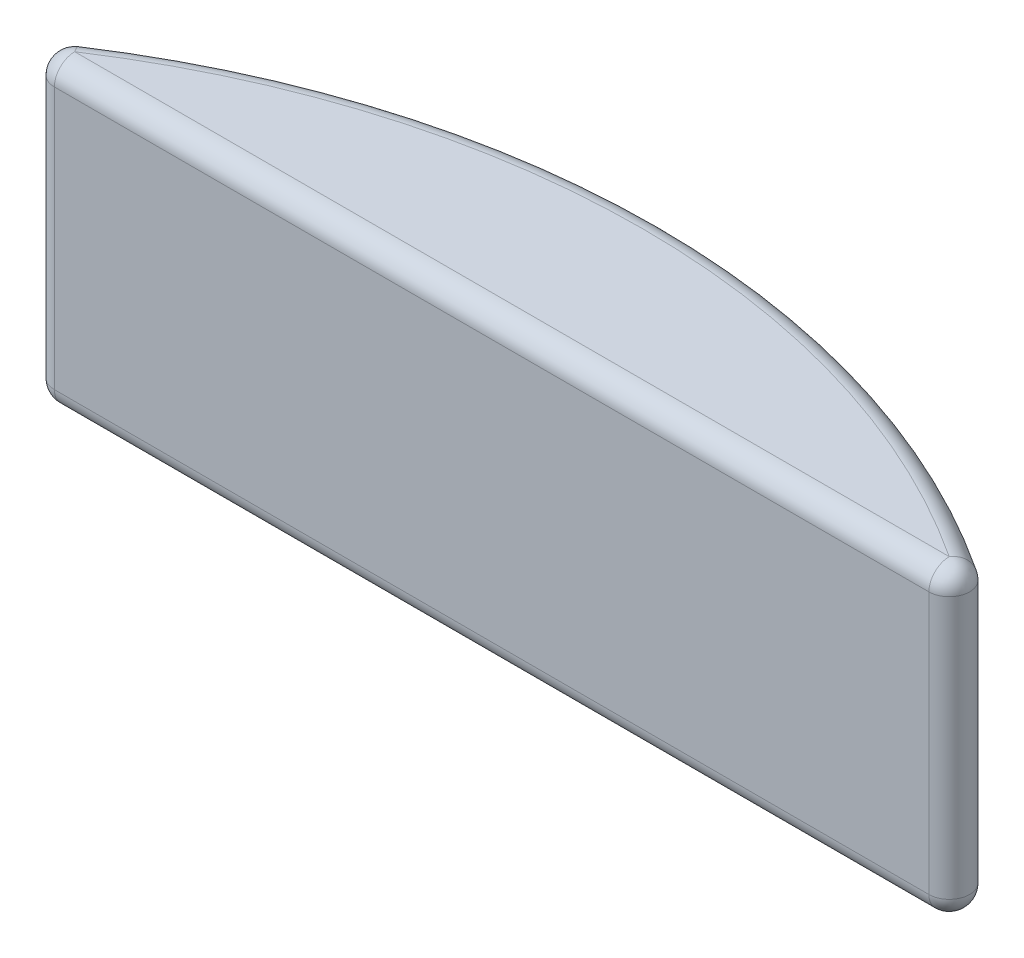
ISO-10303-21;
HEADER;
FILE_DESCRIPTION(('STEP AP214'),'2;1');
FILE_NAME('part.step','',(''),(''),'','','');
FILE_SCHEMA(('AUTOMOTIVE_DESIGN { 1 0 10303 214 1 1 1 1 }'));
ENDSEC;
DATA;
#1=APPLICATION_CONTEXT('core data for automotive mechanical design processes');
#2=APPLICATION_PROTOCOL_DEFINITION('international standard','automotive_design',2000,#1);
#3=PRODUCT_CONTEXT('',#1,'mechanical');
#4=PRODUCT('Part','Part','',(#3));
#5=PRODUCT_RELATED_PRODUCT_CATEGORY('part','',(#4));
#6=PRODUCT_DEFINITION_FORMATION('','',#4);
#7=PRODUCT_DEFINITION_CONTEXT('part definition',#1,'design');
#8=PRODUCT_DEFINITION('design','',#6,#7);
#9=PRODUCT_DEFINITION_SHAPE('','',#8);
#10=(LENGTH_UNIT() NAMED_UNIT(*) SI_UNIT(.MILLI.,.METRE.));
#11=(NAMED_UNIT(*) PLANE_ANGLE_UNIT() SI_UNIT($,.RADIAN.));
#12=(NAMED_UNIT(*) SI_UNIT($,.STERADIAN.) SOLID_ANGLE_UNIT());
#13=UNCERTAINTY_MEASURE_WITH_UNIT(LENGTH_MEASURE(1.E-05),#10,'distance_accuracy_value','');
#14=(GEOMETRIC_REPRESENTATION_CONTEXT(3) GLOBAL_UNCERTAINTY_ASSIGNED_CONTEXT((#13)) GLOBAL_UNIT_ASSIGNED_CONTEXT((#10,
#11,#12)) REPRESENTATION_CONTEXT('',''));
#15=CARTESIAN_POINT('',(0.,0.,0.));
#16=DIRECTION('',(0.,0.,1.));
#17=DIRECTION('',(1.,0.,0.));
#18=AXIS2_PLACEMENT_3D('',#15,#16,#17);
#19=CARTESIAN_POINT('',(34.4079072859714,23.8252,-52.4002));
#20=DIRECTION('',(0.,-1.,0.));
#21=DIRECTION('',(0.,0.,-1.));
#22=AXIS2_PLACEMENT_3D('',#19,#20,#21);
#23=CYLINDRICAL_SURFACE('',#22,1.60020000000001);
#24=DIRECTION('',(0.,-1.,0.));
#25=VECTOR('',#24,1.);
#26=CARTESIAN_POINT('',(34.4079072859714,23.8252,-50.8));
#27=LINE('',#26,#25);
#28=CARTESIAN_POINT('',(34.4079072859714,22.225,-50.8));
#29=VERTEX_POINT('',#28);
#30=CARTESIAN_POINT('',(34.4079072859714,1.6002,-50.8));
#31=VERTEX_POINT('',#30);
#32=EDGE_CURVE('E136',#29,#31,#27,.T.);
#33=ORIENTED_EDGE('',*,*,#32,.T.);
#34=CARTESIAN_POINT('',(34.4079072859714,1.6002,-52.4002));
#35=DIRECTION('',(0.,-1.,0.));
#36=DIRECTION('',(0.,0.,-1.));
#37=AXIS2_PLACEMENT_3D('',#34,#35,#36);
#38=CIRCLE('',#37,1.60020000000001);
#39=CARTESIAN_POINT('',(35.2862290683928,1.6002,-53.7378064019449));
#40=VERTEX_POINT('',#39);
#41=EDGE_CURVE('E144',#31,#40,#38,.F.);
#42=ORIENTED_EDGE('',*,*,#41,.T.);
#43=DIRECTION('',(0.,-1.,0.));
#44=VECTOR('',#43,1.);
#45=CARTESIAN_POINT('',(35.2862290683928,23.8252,-53.7378064019449));
#46=LINE('',#45,#44);
#47=CARTESIAN_POINT('',(35.2862290683928,22.225,-53.7378064019449));
#48=VERTEX_POINT('',#47);
#49=EDGE_CURVE('E117',#48,#40,#46,.T.);
#50=ORIENTED_EDGE('',*,*,#49,.F.);
#51=CARTESIAN_POINT('',(34.4079072859714,22.225,-52.4002));
#52=DIRECTION('',(0.,-1.,0.));
#53=DIRECTION('',(0.,0.,-1.));
#54=AXIS2_PLACEMENT_3D('',#51,#52,#53);
#55=CIRCLE('',#54,1.60020000000001);
#56=EDGE_CURVE('E150',#48,#29,#55,.T.);
#57=ORIENTED_EDGE('',*,*,#56,.T.);
#58=EDGE_LOOP('',(#33,#42,#50,#57));
#59=FACE_BOUND('',#58,.T.);
#60=ADVANCED_FACE('F41',(#59),#23,.T.);
#61=CARTESIAN_POINT('',(0.,23.8252,0.));
#62=DIRECTION('',(0.,-1.,0.));
#63=DIRECTION('',(0.,0.,-1.));
#64=AXIS2_PLACEMENT_3D('',#61,#62,#63);
#65=CYLINDRICAL_SURFACE('',#64,64.2874);
#66=ORIENTED_EDGE('',*,*,#49,.T.);
#67=CARTESIAN_POINT('',(0.,1.6002,0.));
#68=DIRECTION('',(0.,-1.,0.));
#69=DIRECTION('',(0.,0.,-1.));
#70=AXIS2_PLACEMENT_3D('',#67,#68,#69);
#71=CIRCLE('',#70,64.2874);
#72=CARTESIAN_POINT('',(-35.2862290683928,1.6002,-53.7378064019449));
#73=VERTEX_POINT('',#72);
#74=EDGE_CURVE('E118',#40,#73,#71,.F.);
#75=ORIENTED_EDGE('',*,*,#74,.T.);
#76=DIRECTION('',(0.,-1.,0.));
#77=VECTOR('',#76,1.);
#78=CARTESIAN_POINT('',(-35.2862290683928,23.8252,-53.7378064019449));
#79=LINE('',#78,#77);
#80=CARTESIAN_POINT('',(-35.2862290683928,22.225,-53.7378064019449));
#81=VERTEX_POINT('',#80);
#82=EDGE_CURVE('E101',#81,#73,#79,.T.);
#83=ORIENTED_EDGE('',*,*,#82,.F.);
#84=CARTESIAN_POINT('',(0.,22.225,0.));
#85=DIRECTION('',(0.,-1.,0.));
#86=DIRECTION('',(0.,0.,-1.));
#87=AXIS2_PLACEMENT_3D('',#84,#85,#86);
#88=CIRCLE('',#87,64.2874);
#89=EDGE_CURVE('E119',#81,#48,#88,.T.);
#90=ORIENTED_EDGE('',*,*,#89,.T.);
#91=EDGE_LOOP('',(#66,#75,#83,#90));
#92=FACE_BOUND('',#91,.T.);
#93=ADVANCED_FACE('F113',(#92),#65,.T.);
#94=CARTESIAN_POINT('',(-34.4079072859714,23.8252,-52.4002));
#95=DIRECTION('',(0.,-1.,0.));
#96=DIRECTION('',(0.,0.,-1.));
#97=AXIS2_PLACEMENT_3D('',#94,#95,#96);
#98=CYLINDRICAL_SURFACE('',#97,1.60020000000001);
#99=ORIENTED_EDGE('',*,*,#82,.T.);
#100=CARTESIAN_POINT('',(-34.4079072859714,1.6002,-52.4002));
#101=DIRECTION('',(0.,-1.,0.));
#102=DIRECTION('',(0.,0.,-1.));
#103=AXIS2_PLACEMENT_3D('',#100,#101,#102);
#104=CIRCLE('',#103,1.60020000000001);
#105=CARTESIAN_POINT('',(-34.4079072859714,1.6002,-50.8));
#106=VERTEX_POINT('',#105);
#107=EDGE_CURVE('E107',#73,#106,#104,.F.);
#108=ORIENTED_EDGE('',*,*,#107,.T.);
#109=DIRECTION('',(0.,-1.,0.));
#110=VECTOR('',#109,1.);
#111=CARTESIAN_POINT('',(-34.4079072859714,23.8252,-50.8));
#112=LINE('',#111,#110);
#113=CARTESIAN_POINT('',(-34.4079072859714,22.225,-50.8));
#114=VERTEX_POINT('',#113);
#115=EDGE_CURVE('E103',#114,#106,#112,.T.);
#116=ORIENTED_EDGE('',*,*,#115,.F.);
#117=CARTESIAN_POINT('',(-34.4079072859714,22.225,-52.4002));
#118=DIRECTION('',(0.,-1.,0.));
#119=DIRECTION('',(0.,0.,-1.));
#120=AXIS2_PLACEMENT_3D('',#117,#118,#119);
#121=CIRCLE('',#120,1.60020000000001);
#122=EDGE_CURVE('E98',#114,#81,#121,.T.);
#123=ORIENTED_EDGE('',*,*,#122,.T.);
#124=EDGE_LOOP('',(#99,#108,#116,#123));
#125=FACE_BOUND('',#124,.T.);
#126=ADVANCED_FACE('F99',(#125),#98,.T.);
#127=CARTESIAN_POINT('',(-34.4079072859714,23.8252,-50.8));
#128=DIRECTION('',(0.,0.,-1.));
#129=DIRECTION('',(-1.,0.,0.));
#130=AXIS2_PLACEMENT_3D('',#127,#128,#129);
#131=PLANE('',#130);
#132=ORIENTED_EDGE('',*,*,#115,.T.);
#133=DIRECTION('',(1.,0.,0.));
#134=VECTOR('',#133,1.);
#135=CARTESIAN_POINT('',(34.4079072859714,1.6002,-50.8));
#136=LINE('',#135,#134);
#137=EDGE_CURVE('E149',#106,#31,#136,.T.);
#138=ORIENTED_EDGE('',*,*,#137,.T.);
#139=ORIENTED_EDGE('',*,*,#32,.F.);
#140=DIRECTION('',(1.,0.,0.));
#141=VECTOR('',#140,1.);
#142=CARTESIAN_POINT('',(-34.4079072859714,22.225,-50.8));
#143=LINE('',#142,#141);
#144=EDGE_CURVE('E151',#29,#114,#143,.F.);
#145=ORIENTED_EDGE('',*,*,#144,.T.);
#146=EDGE_LOOP('',(#132,#138,#139,#145));
#147=FACE_BOUND('',#146,.T.);
#148=ADVANCED_FACE('F185',(#147),#131,.F.);
#149=CARTESIAN_POINT('',(34.4079072859714,23.8252,-52.4002));
#150=DIRECTION('',(0.,-1.,0.));
#151=DIRECTION('',(0.,0.,-1.));
#152=AXIS2_PLACEMENT_3D('',#149,#150,#151);
#153=PLANE('',#152);
#154=CARTESIAN_POINT('',(0.,23.8252,0.));
#155=DIRECTION('',(0.,-1.,0.));
#156=DIRECTION('',(0.,0.,-1.));
#157=AXIS2_PLACEMENT_3D('',#154,#155,#156);
#158=CIRCLE('',#157,62.6872);
#159=CARTESIAN_POINT('',(34.4079072859713,23.8252,-52.4002));
#160=VERTEX_POINT('',#159);
#161=CARTESIAN_POINT('',(-34.4079072859714,23.8252,-52.4002));
#162=VERTEX_POINT('',#161);
#163=EDGE_CURVE('E49',#160,#162,#158,.F.);
#164=ORIENTED_EDGE('',*,*,#163,.T.);
#165=DIRECTION('',(1.,0.,0.));
#166=VECTOR('',#165,1.);
#167=CARTESIAN_POINT('',(34.4079072859714,23.8252,-52.4002));
#168=LINE('',#167,#166);
#169=EDGE_CURVE('E11',#162,#160,#168,.T.);
#170=ORIENTED_EDGE('',*,*,#169,.T.);
#171=EDGE_LOOP('',(#164,#170));
#172=FACE_BOUND('',#171,.T.);
#173=ADVANCED_FACE('F211',(#172),#153,.F.);
#174=CARTESIAN_POINT('',(34.4079072859714,0.,-52.4002));
#175=DIRECTION('',(0.,-1.,0.));
#176=DIRECTION('',(0.,0.,-1.));
#177=AXIS2_PLACEMENT_3D('',#174,#175,#176);
#178=PLANE('',#177);
#179=DIRECTION('',(1.,0.,0.));
#180=VECTOR('',#179,1.);
#181=CARTESIAN_POINT('',(-34.4079072859714,0.,-52.4002));
#182=LINE('',#181,#180);
#183=CARTESIAN_POINT('',(34.4079072859714,0.,-52.4002));
#184=VERTEX_POINT('',#183);
#185=CARTESIAN_POINT('',(-34.4079072859714,0.,-52.4002));
#186=VERTEX_POINT('',#185);
#187=EDGE_CURVE('E156',#184,#186,#182,.F.);
#188=ORIENTED_EDGE('',*,*,#187,.T.);
#189=CARTESIAN_POINT('',(0.,0.,0.));
#190=DIRECTION('',(0.,-1.,0.));
#191=DIRECTION('',(0.,0.,-1.));
#192=AXIS2_PLACEMENT_3D('',#189,#190,#191);
#193=CIRCLE('',#192,62.6872);
#194=EDGE_CURVE('E108',#186,#184,#193,.T.);
#195=ORIENTED_EDGE('',*,*,#194,.T.);
#196=EDGE_LOOP('',(#188,#195));
#197=FACE_BOUND('',#196,.T.);
#198=ADVANCED_FACE('F210',(#197),#178,.T.);
#199=CARTESIAN_POINT('',(-34.4079072859714,1.6002,-52.4002));
#200=DIRECTION('',(-1.,0.,0.));
#201=DIRECTION('',(0.,0.,1.));
#202=AXIS2_PLACEMENT_3D('',#199,#200,#201);
#203=CYLINDRICAL_SURFACE('',#202,1.6002);
#204=CARTESIAN_POINT('',(34.4079072859714,1.6002,-52.4002));
#205=DIRECTION('',(1.,0.,0.));
#206=DIRECTION('',(0.,0.,-1.));
#207=AXIS2_PLACEMENT_3D('',#204,#205,#206);
#208=CIRCLE('',#207,1.6002);
#209=EDGE_CURVE('E137',#31,#184,#208,.T.);
#210=ORIENTED_EDGE('',*,*,#209,.F.);
#211=ORIENTED_EDGE('',*,*,#137,.F.);
#212=CARTESIAN_POINT('',(-34.4079072859714,1.6002,-52.4002));
#213=DIRECTION('',(-1.,0.,0.));
#214=DIRECTION('',(0.,0.,1.));
#215=AXIS2_PLACEMENT_3D('',#212,#213,#214);
#216=CIRCLE('',#215,1.6002);
#217=EDGE_CURVE('E138',#186,#106,#216,.T.);
#218=ORIENTED_EDGE('',*,*,#217,.F.);
#219=ORIENTED_EDGE('',*,*,#187,.F.);
#220=EDGE_LOOP('',(#210,#211,#218,#219));
#221=FACE_BOUND('',#220,.T.);
#222=ADVANCED_FACE('F168',(#221),#203,.T.);
#223=CARTESIAN_POINT('',(34.4079072859714,1.6002,-52.4002));
#224=DIRECTION('',(0.,-1.,0.));
#225=DIRECTION('',(0.,0.,-1.));
#226=AXIS2_PLACEMENT_3D('',#223,#224,#225);
#227=SPHERICAL_SURFACE('',#226,1.6002);
#228=ORIENTED_EDGE('',*,*,#41,.F.);
#229=ORIENTED_EDGE('',*,*,#209,.T.);
#230=CARTESIAN_POINT('',(34.4079072859714,1.6002,-52.4002));
#231=DIRECTION('',(-0.835899513776344,0.,-0.548882503700447));
#232=DIRECTION('',(-0.548882503700447,0.,0.835899513776344));
#233=AXIS2_PLACEMENT_3D('',#230,#231,#232);
#234=CIRCLE('',#233,1.6002);
#235=EDGE_CURVE('E128',#40,#184,#234,.T.);
#236=ORIENTED_EDGE('',*,*,#235,.F.);
#237=EDGE_LOOP('',(#228,#229,#236));
#238=FACE_BOUND('',#237,.T.);
#239=ADVANCED_FACE('F173',(#238),#227,.T.);
#240=CARTESIAN_POINT('',(-34.4079072859714,1.6002,-52.4002));
#241=DIRECTION('',(0.,-1.,0.));
#242=DIRECTION('',(0.,0.,-1.));
#243=AXIS2_PLACEMENT_3D('',#240,#241,#242);
#244=SPHERICAL_SURFACE('',#243,1.6002);
#245=ORIENTED_EDGE('',*,*,#217,.T.);
#246=ORIENTED_EDGE('',*,*,#107,.F.);
#247=CARTESIAN_POINT('',(-34.4079072859714,1.6002,-52.4002));
#248=DIRECTION('',(0.83589951377634,0.,-0.548882503700453));
#249=DIRECTION('',(-0.548882503700453,0.,-0.83589951377634));
#250=AXIS2_PLACEMENT_3D('',#247,#248,#249);
#251=CIRCLE('',#250,1.6002);
#252=EDGE_CURVE('E129',#186,#73,#251,.T.);
#253=ORIENTED_EDGE('',*,*,#252,.F.);
#254=EDGE_LOOP('',(#245,#246,#253));
#255=FACE_BOUND('',#254,.T.);
#256=ADVANCED_FACE('F182',(#255),#244,.T.);
#257=CARTESIAN_POINT('',(0.,1.6002,0.));
#258=DIRECTION('',(0.,-1.,0.));
#259=DIRECTION('',(0.,0.,-1.));
#260=AXIS2_PLACEMENT_3D('',#257,#258,#259);
#261=TOROIDAL_SURFACE('',#260,62.6872,1.6002);
#262=ORIENTED_EDGE('',*,*,#235,.T.);
#263=ORIENTED_EDGE('',*,*,#194,.F.);
#264=ORIENTED_EDGE('',*,*,#252,.T.);
#265=ORIENTED_EDGE('',*,*,#74,.F.);
#266=EDGE_LOOP('',(#262,#263,#264,#265));
#267=FACE_BOUND('',#266,.T.);
#268=ADVANCED_FACE('F179',(#267),#261,.T.);
#269=CARTESIAN_POINT('',(0.,22.225,0.));
#270=DIRECTION('',(0.,-1.,0.));
#271=DIRECTION('',(0.,0.,-1.));
#272=AXIS2_PLACEMENT_3D('',#269,#270,#271);
#273=TOROIDAL_SURFACE('',#272,62.6872,1.6002);
#274=CARTESIAN_POINT('',(34.4079072859713,22.225,-52.4002));
#275=DIRECTION('',(0.835899513776338,0.,0.548882503700457));
#276=DIRECTION('',(0.548882503700457,0.,-0.835899513776338));
#277=AXIS2_PLACEMENT_3D('',#274,#275,#276);
#278=CIRCLE('',#277,1.6002);
#279=EDGE_CURVE('E121',#48,#160,#278,.T.);
#280=ORIENTED_EDGE('',*,*,#279,.F.);
#281=ORIENTED_EDGE('',*,*,#89,.F.);
#282=CARTESIAN_POINT('',(-34.4079072859714,22.225,-52.4002));
#283=DIRECTION('',(-0.83589951377634,0.,0.548882503700454));
#284=DIRECTION('',(0.548882503700454,0.,0.83589951377634));
#285=AXIS2_PLACEMENT_3D('',#282,#283,#284);
#286=CIRCLE('',#285,1.6002);
#287=EDGE_CURVE('E44',#162,#81,#286,.T.);
#288=ORIENTED_EDGE('',*,*,#287,.F.);
#289=ORIENTED_EDGE('',*,*,#163,.F.);
#290=EDGE_LOOP('',(#280,#281,#288,#289));
#291=FACE_BOUND('',#290,.T.);
#292=ADVANCED_FACE('F43',(#291),#273,.T.);
#293=CARTESIAN_POINT('',(-34.4079072859714,22.225,-52.4002));
#294=DIRECTION('',(0.,-1.,0.));
#295=DIRECTION('',(0.,0.,-1.));
#296=AXIS2_PLACEMENT_3D('',#293,#294,#295);
#297=SPHERICAL_SURFACE('',#296,1.6002);
#298=ORIENTED_EDGE('',*,*,#287,.T.);
#299=ORIENTED_EDGE('',*,*,#122,.F.);
#300=CARTESIAN_POINT('',(-34.4079072859714,22.225,-52.4002));
#301=DIRECTION('',(1.,0.,0.));
#302=DIRECTION('',(0.,0.,-1.));
#303=AXIS2_PLACEMENT_3D('',#300,#301,#302);
#304=CIRCLE('',#303,1.6002);
#305=EDGE_CURVE('E126',#162,#114,#304,.T.);
#306=ORIENTED_EDGE('',*,*,#305,.F.);
#307=EDGE_LOOP('',(#298,#299,#306));
#308=FACE_BOUND('',#307,.T.);
#309=ADVANCED_FACE('F130',(#308),#297,.T.);
#310=CARTESIAN_POINT('',(34.4079072859714,22.225,-52.4002));
#311=DIRECTION('',(0.,-1.,0.));
#312=DIRECTION('',(0.,0.,-1.));
#313=AXIS2_PLACEMENT_3D('',#310,#311,#312);
#314=SPHERICAL_SURFACE('',#313,1.6002);
#315=ORIENTED_EDGE('',*,*,#56,.F.);
#316=ORIENTED_EDGE('',*,*,#279,.T.);
#317=CARTESIAN_POINT('',(34.4079072859714,22.225,-52.4002));
#318=DIRECTION('',(-1.,0.,0.));
#319=DIRECTION('',(0.,0.,1.));
#320=AXIS2_PLACEMENT_3D('',#317,#318,#319);
#321=CIRCLE('',#320,1.6002);
#322=EDGE_CURVE('E65',#29,#160,#321,.T.);
#323=ORIENTED_EDGE('',*,*,#322,.F.);
#324=EDGE_LOOP('',(#315,#316,#323));
#325=FACE_BOUND('',#324,.T.);
#326=ADVANCED_FACE('F184',(#325),#314,.T.);
#327=CARTESIAN_POINT('',(34.4079072859714,22.225,-52.4002));
#328=DIRECTION('',(1.,0.,0.));
#329=DIRECTION('',(0.,0.,-1.));
#330=AXIS2_PLACEMENT_3D('',#327,#328,#329);
#331=CYLINDRICAL_SURFACE('',#330,1.6002);
#332=ORIENTED_EDGE('',*,*,#305,.T.);
#333=ORIENTED_EDGE('',*,*,#144,.F.);
#334=ORIENTED_EDGE('',*,*,#322,.T.);
#335=ORIENTED_EDGE('',*,*,#169,.F.);
#336=EDGE_LOOP('',(#332,#333,#334,#335));
#337=FACE_BOUND('',#336,.T.);
#338=ADVANCED_FACE('F181',(#337),#331,.T.);
#339=CLOSED_SHELL('',(#60,#93,#126,#148,#173,#198,#222,#239,#256,#268,#292,#309,#326,#338));
#340=MANIFOLD_SOLID_BREP('B2',#339);
#341=ADVANCED_BREP_SHAPE_REPRESENTATION('',(#18,#340),#14);
#342=SHAPE_DEFINITION_REPRESENTATION(#9,#341);
ENDSEC;
END-ISO-10303-21;
